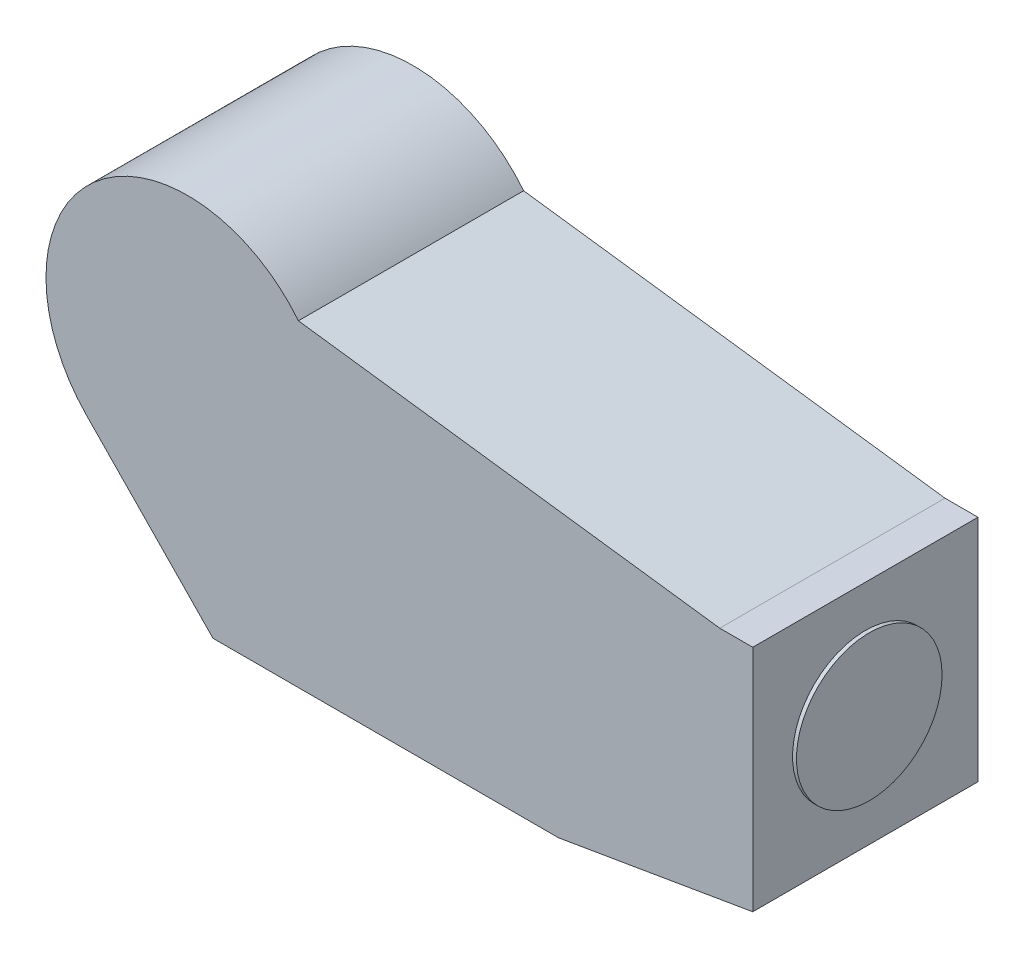
ISO-10303-21;
HEADER;
FILE_DESCRIPTION(('STEP AP214'),'2;1');
FILE_NAME('part.step','',(''),(''),'','','');
FILE_SCHEMA(('AUTOMOTIVE_DESIGN { 1 0 10303 214 1 1 1 1 }'));
ENDSEC;
DATA;
#1=APPLICATION_CONTEXT('core data for automotive mechanical design processes');
#2=APPLICATION_PROTOCOL_DEFINITION('international standard','automotive_design',2000,#1);
#3=PRODUCT_CONTEXT('',#1,'mechanical');
#4=PRODUCT('Part','Part','',(#3));
#5=PRODUCT_RELATED_PRODUCT_CATEGORY('part','',(#4));
#6=PRODUCT_DEFINITION_FORMATION('','',#4);
#7=PRODUCT_DEFINITION_CONTEXT('part definition',#1,'design');
#8=PRODUCT_DEFINITION('design','',#6,#7);
#9=PRODUCT_DEFINITION_SHAPE('','',#8);
#10=(LENGTH_UNIT() NAMED_UNIT(*) SI_UNIT(.MILLI.,.METRE.));
#11=(NAMED_UNIT(*) PLANE_ANGLE_UNIT() SI_UNIT($,.RADIAN.));
#12=(NAMED_UNIT(*) SI_UNIT($,.STERADIAN.) SOLID_ANGLE_UNIT());
#13=UNCERTAINTY_MEASURE_WITH_UNIT(LENGTH_MEASURE(1.E-05),#10,'distance_accuracy_value','');
#14=(GEOMETRIC_REPRESENTATION_CONTEXT(3) GLOBAL_UNCERTAINTY_ASSIGNED_CONTEXT((#13)) GLOBAL_UNIT_ASSIGNED_CONTEXT((#10,
#11,#12)) REPRESENTATION_CONTEXT('',''));
#15=CARTESIAN_POINT('',(0.,0.,0.));
#16=DIRECTION('',(0.,0.,1.));
#17=DIRECTION('',(1.,0.,0.));
#18=AXIS2_PLACEMENT_3D('',#15,#16,#17);
#19=CARTESIAN_POINT('',(291.,0.,58.));
#20=DIRECTION('',(-1.,0.,0.));
#21=DIRECTION('',(0.,0.,1.));
#22=AXIS2_PLACEMENT_3D('',#19,#20,#21);
#23=PLANE('',#22);
#24=CARTESIAN_POINT('',(291.,-42.,0.));
#25=DIRECTION('',(1.,0.,0.));
#26=DIRECTION('',(0.,0.,-1.));
#27=AXIS2_PLACEMENT_3D('',#24,#25,#26);
#28=CIRCLE('',#27,37.5);
#29=CARTESIAN_POINT('',(291.,-42.,-37.5));
#30=VERTEX_POINT('',#29);
#31=EDGE_CURVE('E11',#30,#30,#28,.T.);
#32=ORIENTED_EDGE('',*,*,#31,.F.);
#33=EDGE_LOOP('',(#32));
#34=FACE_BOUND('',#33,.T.);
#35=DIRECTION('',(0.,1.,0.));
#36=VECTOR('',#35,1.);
#37=CARTESIAN_POINT('',(291.,0.,-58.));
#38=LINE('',#37,#36);
#39=CARTESIAN_POINT('',(291.,-101.,-58.));
#40=VERTEX_POINT('',#39);
#41=CARTESIAN_POINT('',(291.,17.,-58.));
#42=VERTEX_POINT('',#41);
#43=EDGE_CURVE('E90',#40,#42,#38,.T.);
#44=ORIENTED_EDGE('',*,*,#43,.T.);
#45=DIRECTION('',(0.,0.,-1.));
#46=VECTOR('',#45,1.);
#47=CARTESIAN_POINT('',(291.,17.,58.));
#48=LINE('',#47,#46);
#49=CARTESIAN_POINT('',(291.,17.,58.));
#50=VERTEX_POINT('',#49);
#51=EDGE_CURVE('E42',#50,#42,#48,.T.);
#52=ORIENTED_EDGE('',*,*,#51,.F.);
#53=DIRECTION('',(0.,1.,0.));
#54=VECTOR('',#53,1.);
#55=CARTESIAN_POINT('',(291.,0.,58.));
#56=LINE('',#55,#54);
#57=CARTESIAN_POINT('',(291.,-101.,58.));
#58=VERTEX_POINT('',#57);
#59=EDGE_CURVE('E96',#58,#50,#56,.T.);
#60=ORIENTED_EDGE('',*,*,#59,.F.);
#61=DIRECTION('',(0.,0.,-1.));
#62=VECTOR('',#61,1.);
#63=CARTESIAN_POINT('',(291.,-101.,58.));
#64=LINE('',#63,#62);
#65=EDGE_CURVE('E131',#58,#40,#64,.T.);
#66=ORIENTED_EDGE('',*,*,#65,.T.);
#67=EDGE_LOOP('',(#44,#52,#60,#66));
#68=FACE_BOUND('',#67,.T.);
#69=ADVANCED_FACE('F39',(#34,#68),#23,.F.);
#70=CARTESIAN_POINT('',(291.,17.,58.));
#71=DIRECTION('',(0.,-1.,0.));
#72=DIRECTION('',(1.,0.,0.));
#73=AXIS2_PLACEMENT_3D('',#70,#71,#72);
#74=PLANE('',#73);
#75=DIRECTION('',(-1.,0.,0.));
#76=VECTOR('',#75,1.);
#77=CARTESIAN_POINT('',(291.,17.,-58.));
#78=LINE('',#77,#76);
#79=CARTESIAN_POINT('',(274.,17.,-58.));
#80=VERTEX_POINT('',#79);
#81=EDGE_CURVE('E137',#42,#80,#78,.T.);
#82=ORIENTED_EDGE('',*,*,#81,.T.);
#83=DIRECTION('',(0.,0.,-1.));
#84=VECTOR('',#83,1.);
#85=CARTESIAN_POINT('',(274.,17.,58.));
#86=LINE('',#85,#84);
#87=CARTESIAN_POINT('',(274.,17.,58.));
#88=VERTEX_POINT('',#87);
#89=EDGE_CURVE('E164',#88,#80,#86,.T.);
#90=ORIENTED_EDGE('',*,*,#89,.F.);
#91=DIRECTION('',(-1.,0.,0.));
#92=VECTOR('',#91,1.);
#93=CARTESIAN_POINT('',(291.,17.,58.));
#94=LINE('',#93,#92);
#95=EDGE_CURVE('E176',#50,#88,#94,.T.);
#96=ORIENTED_EDGE('',*,*,#95,.F.);
#97=ORIENTED_EDGE('',*,*,#51,.T.);
#98=EDGE_LOOP('',(#82,#90,#96,#97));
#99=FACE_BOUND('',#98,.T.);
#100=ADVANCED_FACE('F175',(#99),#74,.F.);
#101=CARTESIAN_POINT('',(274.,17.,58.));
#102=DIRECTION('',(-0.130698754240664,-0.991422127874872,0.));
#103=DIRECTION('',(0.991422127874872,-0.130698754240664,0.));
#104=AXIS2_PLACEMENT_3D('',#101,#102,#103);
#105=PLANE('',#104);
#106=DIRECTION('',(-0.991422127874872,0.130698754240664,0.));
#107=VECTOR('',#106,1.);
#108=CARTESIAN_POINT('',(274.,17.,-58.));
#109=LINE('',#108,#107);
#110=CARTESIAN_POINT('',(57.,45.6070170039655,-58.));
#111=VERTEX_POINT('',#110);
#112=EDGE_CURVE('E141',#80,#111,#109,.T.);
#113=ORIENTED_EDGE('',*,*,#112,.T.);
#114=DIRECTION('',(0.,0.,-1.));
#115=VECTOR('',#114,1.);
#116=CARTESIAN_POINT('',(57.,45.6070170039655,58.));
#117=LINE('',#116,#115);
#118=CARTESIAN_POINT('',(57.,45.6070170039655,58.));
#119=VERTEX_POINT('',#118);
#120=EDGE_CURVE('E161',#119,#111,#117,.T.);
#121=ORIENTED_EDGE('',*,*,#120,.F.);
#122=DIRECTION('',(-0.991422127874872,0.130698754240664,0.));
#123=VECTOR('',#122,1.);
#124=CARTESIAN_POINT('',(274.,17.,58.));
#125=LINE('',#124,#123);
#126=EDGE_CURVE('E185',#88,#119,#125,.T.);
#127=ORIENTED_EDGE('',*,*,#126,.F.);
#128=ORIENTED_EDGE('',*,*,#89,.T.);
#129=EDGE_LOOP('',(#113,#121,#127,#128));
#130=FACE_BOUND('',#129,.T.);
#131=ADVANCED_FACE('F181',(#130),#105,.F.);
#132=CARTESIAN_POINT('',(0.,0.,58.));
#133=DIRECTION('',(0.,0.,-1.));
#134=DIRECTION('',(-1.,0.,0.));
#135=AXIS2_PLACEMENT_3D('',#132,#133,#134);
#136=CYLINDRICAL_SURFACE('',#135,73.);
#137=CARTESIAN_POINT('',(0.,0.,-58.));
#138=DIRECTION('',(0.,0.,1.));
#139=DIRECTION('',(1.,0.,0.));
#140=AXIS2_PLACEMENT_3D('',#137,#138,#139);
#141=CIRCLE('',#140,73.);
#142=CARTESIAN_POINT('',(-52.3049225386602,-50.9234236695134,-58.));
#143=VERTEX_POINT('',#142);
#144=EDGE_CURVE('E144',#111,#143,#141,.T.);
#145=ORIENTED_EDGE('',*,*,#144,.T.);
#146=DIRECTION('',(0.,0.,-1.));
#147=VECTOR('',#146,1.);
#148=CARTESIAN_POINT('',(-52.3049225386602,-50.9234236695134,58.));
#149=LINE('',#148,#147);
#150=CARTESIAN_POINT('',(-52.3049225386602,-50.9234236695134,58.));
#151=VERTEX_POINT('',#150);
#152=EDGE_CURVE('E124',#151,#143,#149,.T.);
#153=ORIENTED_EDGE('',*,*,#152,.F.);
#154=CARTESIAN_POINT('',(0.,0.,58.));
#155=DIRECTION('',(0.,0.,1.));
#156=DIRECTION('',(1.,0.,0.));
#157=AXIS2_PLACEMENT_3D('',#154,#155,#156);
#158=CIRCLE('',#157,73.);
#159=EDGE_CURVE('E113',#119,#151,#158,.T.);
#160=ORIENTED_EDGE('',*,*,#159,.F.);
#161=ORIENTED_EDGE('',*,*,#120,.T.);
#162=EDGE_LOOP('',(#145,#153,#160,#161));
#163=FACE_BOUND('',#162,.T.);
#164=ADVANCED_FACE('F183',(#163),#136,.T.);
#165=CARTESIAN_POINT('',(13.,-118.,58.));
#166=DIRECTION('',(0.716505788200825,0.697581146157718,0.));
#167=DIRECTION('',(-0.697581146157718,0.716505788200825,0.));
#168=AXIS2_PLACEMENT_3D('',#165,#166,#167);
#169=PLANE('',#168);
#170=DIRECTION('',(0.697581146157718,-0.716505788200825,0.));
#171=VECTOR('',#170,1.);
#172=CARTESIAN_POINT('',(13.,-118.,-58.));
#173=LINE('',#172,#171);
#174=CARTESIAN_POINT('',(13.,-118.,-58.));
#175=VERTEX_POINT('',#174);
#176=EDGE_CURVE('E122',#143,#175,#173,.T.);
#177=ORIENTED_EDGE('',*,*,#176,.T.);
#178=DIRECTION('',(0.,0.,-1.));
#179=VECTOR('',#178,1.);
#180=CARTESIAN_POINT('',(13.,-118.,58.));
#181=LINE('',#180,#179);
#182=CARTESIAN_POINT('',(13.,-118.,58.));
#183=VERTEX_POINT('',#182);
#184=EDGE_CURVE('E119',#183,#175,#181,.T.);
#185=ORIENTED_EDGE('',*,*,#184,.F.);
#186=DIRECTION('',(0.697581146157718,-0.716505788200825,0.));
#187=VECTOR('',#186,1.);
#188=CARTESIAN_POINT('',(13.,-118.,58.));
#189=LINE('',#188,#187);
#190=EDGE_CURVE('E107',#151,#183,#189,.T.);
#191=ORIENTED_EDGE('',*,*,#190,.F.);
#192=ORIENTED_EDGE('',*,*,#152,.T.);
#193=EDGE_LOOP('',(#177,#185,#191,#192));
#194=FACE_BOUND('',#193,.T.);
#195=ADVANCED_FACE('F120',(#194),#169,.F.);
#196=CARTESIAN_POINT('',(191.,-118.,58.));
#197=DIRECTION('',(0.,1.,0.));
#198=DIRECTION('',(-1.,0.,0.));
#199=AXIS2_PLACEMENT_3D('',#196,#197,#198);
#200=PLANE('',#199);
#201=DIRECTION('',(1.,0.,0.));
#202=VECTOR('',#201,1.);
#203=CARTESIAN_POINT('',(191.,-118.,-58.));
#204=LINE('',#203,#202);
#205=CARTESIAN_POINT('',(191.,-118.,-58.));
#206=VERTEX_POINT('',#205);
#207=EDGE_CURVE('E83',#175,#206,#204,.T.);
#208=ORIENTED_EDGE('',*,*,#207,.T.);
#209=DIRECTION('',(0.,0.,-1.));
#210=VECTOR('',#209,1.);
#211=CARTESIAN_POINT('',(191.,-118.,58.));
#212=LINE('',#211,#210);
#213=CARTESIAN_POINT('',(191.,-118.,58.));
#214=VERTEX_POINT('',#213);
#215=EDGE_CURVE('E125',#214,#206,#212,.T.);
#216=ORIENTED_EDGE('',*,*,#215,.F.);
#217=DIRECTION('',(1.,0.,0.));
#218=VECTOR('',#217,1.);
#219=CARTESIAN_POINT('',(191.,-118.,58.));
#220=LINE('',#219,#218);
#221=EDGE_CURVE('E111',#183,#214,#220,.T.);
#222=ORIENTED_EDGE('',*,*,#221,.F.);
#223=ORIENTED_EDGE('',*,*,#184,.T.);
#224=EDGE_LOOP('',(#208,#216,#222,#223));
#225=FACE_BOUND('',#224,.T.);
#226=ADVANCED_FACE('F127',(#225),#200,.F.);
#227=CARTESIAN_POINT('',(291.,-101.,58.));
#228=DIRECTION('',(-0.167595493933869,0.985855846669817,0.));
#229=DIRECTION('',(-0.985855846669817,-0.167595493933869,0.));
#230=AXIS2_PLACEMENT_3D('',#227,#228,#229);
#231=PLANE('',#230);
#232=DIRECTION('',(0.985855846669817,0.167595493933869,0.));
#233=VECTOR('',#232,1.);
#234=CARTESIAN_POINT('',(291.,-101.,-58.));
#235=LINE('',#234,#233);
#236=EDGE_CURVE('E151',#206,#40,#235,.T.);
#237=ORIENTED_EDGE('',*,*,#236,.T.);
#238=ORIENTED_EDGE('',*,*,#65,.F.);
#239=DIRECTION('',(0.985855846669817,0.167595493933869,0.));
#240=VECTOR('',#239,1.);
#241=CARTESIAN_POINT('',(291.,-101.,58.));
#242=LINE('',#241,#240);
#243=EDGE_CURVE('E57',#214,#58,#242,.T.);
#244=ORIENTED_EDGE('',*,*,#243,.F.);
#245=ORIENTED_EDGE('',*,*,#215,.T.);
#246=EDGE_LOOP('',(#237,#238,#244,#245));
#247=FACE_BOUND('',#246,.T.);
#248=ADVANCED_FACE('F207',(#247),#231,.F.);
#249=CARTESIAN_POINT('',(0.,0.,58.));
#250=DIRECTION('',(0.,0.,1.));
#251=DIRECTION('',(1.,0.,0.));
#252=AXIS2_PLACEMENT_3D('',#249,#250,#251);
#253=PLANE('',#252);
#254=ORIENTED_EDGE('',*,*,#59,.T.);
#255=ORIENTED_EDGE('',*,*,#95,.T.);
#256=ORIENTED_EDGE('',*,*,#126,.T.);
#257=ORIENTED_EDGE('',*,*,#159,.T.);
#258=ORIENTED_EDGE('',*,*,#190,.T.);
#259=ORIENTED_EDGE('',*,*,#221,.T.);
#260=ORIENTED_EDGE('',*,*,#243,.T.);
#261=EDGE_LOOP('',(#254,#255,#256,#257,#258,#259,#260));
#262=FACE_BOUND('',#261,.T.);
#263=ADVANCED_FACE('F109',(#262),#253,.T.);
#264=CARTESIAN_POINT('',(0.,0.,-58.));
#265=DIRECTION('',(0.,0.,1.));
#266=DIRECTION('',(1.,0.,0.));
#267=AXIS2_PLACEMENT_3D('',#264,#265,#266);
#268=PLANE('',#267);
#269=ORIENTED_EDGE('',*,*,#43,.F.);
#270=ORIENTED_EDGE('',*,*,#236,.F.);
#271=ORIENTED_EDGE('',*,*,#207,.F.);
#272=ORIENTED_EDGE('',*,*,#176,.F.);
#273=ORIENTED_EDGE('',*,*,#144,.F.);
#274=ORIENTED_EDGE('',*,*,#112,.F.);
#275=ORIENTED_EDGE('',*,*,#81,.F.);
#276=EDGE_LOOP('',(#269,#270,#271,#272,#273,#274,#275));
#277=FACE_BOUND('',#276,.T.);
#278=ADVANCED_FACE('F178',(#277),#268,.F.);
#279=CARTESIAN_POINT('',(293.,-42.,0.));
#280=DIRECTION('',(-1.,0.,0.));
#281=DIRECTION('',(0.,0.,1.));
#282=AXIS2_PLACEMENT_3D('',#279,#280,#281);
#283=CYLINDRICAL_SURFACE('',#282,37.5);
#284=CARTESIAN_POINT('',(293.,-42.,0.));
#285=DIRECTION('',(1.,0.,0.));
#286=DIRECTION('',(0.,0.,-1.));
#287=AXIS2_PLACEMENT_3D('',#284,#285,#286);
#288=CIRCLE('',#287,37.5);
#289=CARTESIAN_POINT('',(293.,-42.,-37.5));
#290=VERTEX_POINT('',#289);
#291=EDGE_CURVE('E138',#290,#290,#288,.T.);
#292=ORIENTED_EDGE('',*,*,#291,.F.);
#293=EDGE_LOOP('',(#292));
#294=FACE_BOUND('',#293,.T.);
#295=ORIENTED_EDGE('',*,*,#31,.T.);
#296=EDGE_LOOP('',(#295));
#297=FACE_BOUND('',#296,.T.);
#298=ADVANCED_FACE('F199',(#294,#297),#283,.T.);
#299=CARTESIAN_POINT('',(293.,-42.,0.));
#300=DIRECTION('',(1.,0.,0.));
#301=DIRECTION('',(0.,0.,-1.));
#302=AXIS2_PLACEMENT_3D('',#299,#300,#301);
#303=PLANE('',#302);
#304=ORIENTED_EDGE('',*,*,#291,.T.);
#305=EDGE_LOOP('',(#304));
#306=FACE_BOUND('',#305,.T.);
#307=ADVANCED_FACE('F197',(#306),#303,.T.);
#308=CLOSED_SHELL('',(#69,#100,#131,#164,#195,#226,#248,#263,#278,#298,#307));
#309=MANIFOLD_SOLID_BREP('B2',#308);
#310=ADVANCED_BREP_SHAPE_REPRESENTATION('',(#18,#309),#14);
#311=SHAPE_DEFINITION_REPRESENTATION(#9,#310);
ENDSEC;
END-ISO-10303-21;
